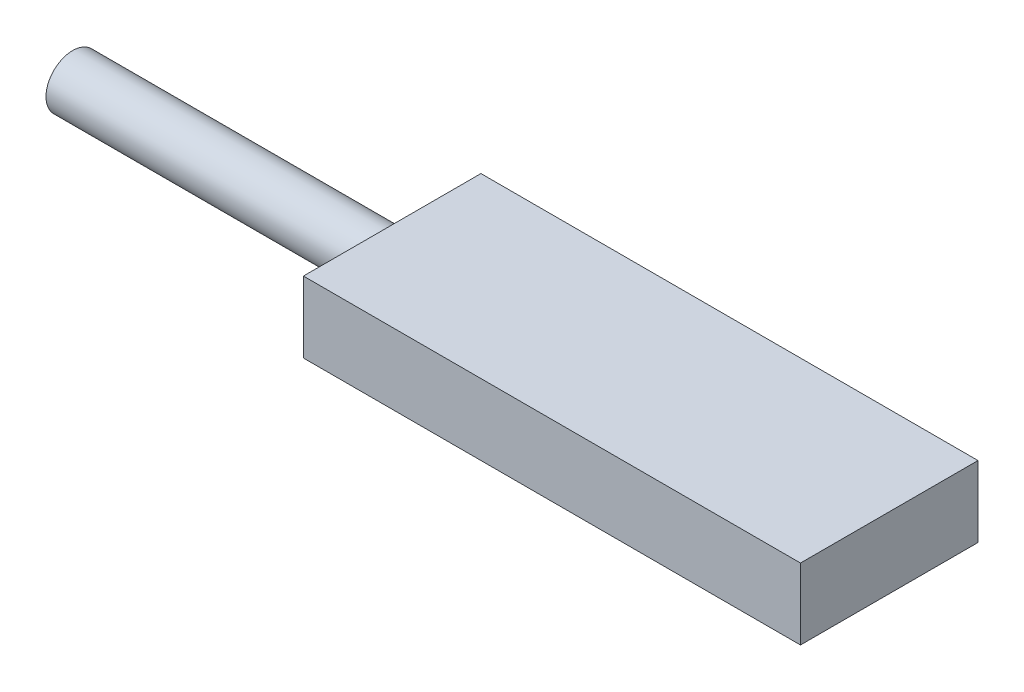
ISO-10303-21;
HEADER;
FILE_DESCRIPTION(('STEP AP214'),'2;1');
FILE_NAME('part.step','',(''),(''),'','','');
FILE_SCHEMA(('AUTOMOTIVE_DESIGN { 1 0 10303 214 1 1 1 1 }'));
ENDSEC;
DATA;
#1=APPLICATION_CONTEXT('core data for automotive mechanical design processes');
#2=APPLICATION_PROTOCOL_DEFINITION('international standard','automotive_design',2000,#1);
#3=PRODUCT_CONTEXT('',#1,'mechanical');
#4=PRODUCT('Part','Part','',(#3));
#5=PRODUCT_RELATED_PRODUCT_CATEGORY('part','',(#4));
#6=PRODUCT_DEFINITION_FORMATION('','',#4);
#7=PRODUCT_DEFINITION_CONTEXT('part definition',#1,'design');
#8=PRODUCT_DEFINITION('design','',#6,#7);
#9=PRODUCT_DEFINITION_SHAPE('','',#8);
#10=(LENGTH_UNIT() NAMED_UNIT(*) SI_UNIT(.MILLI.,.METRE.));
#11=(NAMED_UNIT(*) PLANE_ANGLE_UNIT() SI_UNIT($,.RADIAN.));
#12=(NAMED_UNIT(*) SI_UNIT($,.STERADIAN.) SOLID_ANGLE_UNIT());
#13=UNCERTAINTY_MEASURE_WITH_UNIT(LENGTH_MEASURE(1.E-05),#10,'distance_accuracy_value','');
#14=(GEOMETRIC_REPRESENTATION_CONTEXT(3) GLOBAL_UNCERTAINTY_ASSIGNED_CONTEXT((#13)) GLOBAL_UNIT_ASSIGNED_CONTEXT((#10,
#11,#12)) REPRESENTATION_CONTEXT('',''));
#15=CARTESIAN_POINT('',(0.,0.,0.));
#16=DIRECTION('',(0.,0.,1.));
#17=DIRECTION('',(1.,0.,0.));
#18=AXIS2_PLACEMENT_3D('',#15,#16,#17);
#19=CARTESIAN_POINT('',(44.45,12.7,15.875));
#20=DIRECTION('',(-1.,0.,0.));
#21=DIRECTION('',(0.,0.,1.));
#22=AXIS2_PLACEMENT_3D('',#19,#20,#21);
#23=PLANE('',#22);
#24=DIRECTION('',(0.,0.,-1.));
#25=VECTOR('',#24,1.);
#26=CARTESIAN_POINT('',(44.45,0.,15.875));
#27=LINE('',#26,#25);
#28=CARTESIAN_POINT('',(44.45,0.,15.875));
#29=VERTEX_POINT('',#28);
#30=CARTESIAN_POINT('',(44.45,0.,-15.875));
#31=VERTEX_POINT('',#30);
#32=EDGE_CURVE('E100',#29,#31,#27,.T.);
#33=ORIENTED_EDGE('',*,*,#32,.T.);
#34=DIRECTION('',(0.,-1.,0.));
#35=VECTOR('',#34,1.);
#36=CARTESIAN_POINT('',(44.45,12.7,-15.875));
#37=LINE('',#36,#35);
#38=CARTESIAN_POINT('',(44.45,12.7,-15.875));
#39=VERTEX_POINT('',#38);
#40=EDGE_CURVE('E37',#39,#31,#37,.T.);
#41=ORIENTED_EDGE('',*,*,#40,.F.);
#42=DIRECTION('',(0.,0.,-1.));
#43=VECTOR('',#42,1.);
#44=CARTESIAN_POINT('',(44.45,12.7,15.875));
#45=LINE('',#44,#43);
#46=CARTESIAN_POINT('',(44.45,12.7,15.875));
#47=VERTEX_POINT('',#46);
#48=EDGE_CURVE('E87',#47,#39,#45,.T.);
#49=ORIENTED_EDGE('',*,*,#48,.F.);
#50=DIRECTION('',(0.,-1.,0.));
#51=VECTOR('',#50,1.);
#52=CARTESIAN_POINT('',(44.45,12.7,15.875));
#53=LINE('',#52,#51);
#54=EDGE_CURVE('E96',#47,#29,#53,.T.);
#55=ORIENTED_EDGE('',*,*,#54,.T.);
#56=EDGE_LOOP('',(#33,#41,#49,#55));
#57=FACE_BOUND('',#56,.T.);
#58=ADVANCED_FACE('F34',(#57),#23,.F.);
#59=CARTESIAN_POINT('',(-44.45,12.7,-15.875));
#60=DIRECTION('',(0.,0.,1.));
#61=DIRECTION('',(1.,0.,0.));
#62=AXIS2_PLACEMENT_3D('',#59,#60,#61);
#63=PLANE('',#62);
#64=DIRECTION('',(-1.,0.,0.));
#65=VECTOR('',#64,1.);
#66=CARTESIAN_POINT('',(-44.45,0.,-15.875));
#67=LINE('',#66,#65);
#68=CARTESIAN_POINT('',(-44.45,0.,-15.875));
#69=VERTEX_POINT('',#68);
#70=EDGE_CURVE('E92',#31,#69,#67,.T.);
#71=ORIENTED_EDGE('',*,*,#70,.T.);
#72=DIRECTION('',(0.,-1.,0.));
#73=VECTOR('',#72,1.);
#74=CARTESIAN_POINT('',(-44.45,12.7,-15.875));
#75=LINE('',#74,#73);
#76=CARTESIAN_POINT('',(-44.45,12.7,-15.875));
#77=VERTEX_POINT('',#76);
#78=EDGE_CURVE('E90',#77,#69,#75,.T.);
#79=ORIENTED_EDGE('',*,*,#78,.F.);
#80=DIRECTION('',(-1.,0.,0.));
#81=VECTOR('',#80,1.);
#82=CARTESIAN_POINT('',(-44.45,12.7,-15.875));
#83=LINE('',#82,#81);
#84=EDGE_CURVE('E82',#39,#77,#83,.T.);
#85=ORIENTED_EDGE('',*,*,#84,.F.);
#86=ORIENTED_EDGE('',*,*,#40,.T.);
#87=EDGE_LOOP('',(#71,#79,#85,#86));
#88=FACE_BOUND('',#87,.T.);
#89=ADVANCED_FACE('F91',(#88),#63,.F.);
#90=CARTESIAN_POINT('',(-44.45,12.7,15.875));
#91=DIRECTION('',(1.,0.,0.));
#92=DIRECTION('',(0.,0.,-1.));
#93=AXIS2_PLACEMENT_3D('',#90,#91,#92);
#94=PLANE('',#93);
#95=CARTESIAN_POINT('',(-44.45,6.35,0.));
#96=DIRECTION('',(-1.,0.,0.));
#97=DIRECTION('',(0.,0.,1.));
#98=AXIS2_PLACEMENT_3D('',#95,#96,#97);
#99=CIRCLE('',#98,4.7625);
#100=CARTESIAN_POINT('',(-44.45,6.35,4.7625));
#101=VERTEX_POINT('',#100);
#102=EDGE_CURVE('E11',#101,#101,#99,.T.);
#103=ORIENTED_EDGE('',*,*,#102,.F.);
#104=EDGE_LOOP('',(#103));
#105=FACE_BOUND('',#104,.T.);
#106=DIRECTION('',(0.,0.,1.));
#107=VECTOR('',#106,1.);
#108=CARTESIAN_POINT('',(-44.45,0.,15.875));
#109=LINE('',#108,#107);
#110=CARTESIAN_POINT('',(-44.45,0.,15.875));
#111=VERTEX_POINT('',#110);
#112=EDGE_CURVE('E68',#69,#111,#109,.T.);
#113=ORIENTED_EDGE('',*,*,#112,.T.);
#114=DIRECTION('',(0.,-1.,0.));
#115=VECTOR('',#114,1.);
#116=CARTESIAN_POINT('',(-44.45,12.7,15.875));
#117=LINE('',#116,#115);
#118=CARTESIAN_POINT('',(-44.45,12.7,15.875));
#119=VERTEX_POINT('',#118);
#120=EDGE_CURVE('E93',#119,#111,#117,.T.);
#121=ORIENTED_EDGE('',*,*,#120,.F.);
#122=DIRECTION('',(0.,0.,1.));
#123=VECTOR('',#122,1.);
#124=CARTESIAN_POINT('',(-44.45,12.7,15.875));
#125=LINE('',#124,#123);
#126=EDGE_CURVE('E85',#77,#119,#125,.T.);
#127=ORIENTED_EDGE('',*,*,#126,.F.);
#128=ORIENTED_EDGE('',*,*,#78,.T.);
#129=EDGE_LOOP('',(#113,#121,#127,#128));
#130=FACE_BOUND('',#129,.T.);
#131=ADVANCED_FACE('F94',(#105,#130),#94,.F.);
#132=CARTESIAN_POINT('',(-44.45,12.7,15.875));
#133=DIRECTION('',(0.,0.,-1.));
#134=DIRECTION('',(-1.,0.,0.));
#135=AXIS2_PLACEMENT_3D('',#132,#133,#134);
#136=PLANE('',#135);
#137=DIRECTION('',(1.,0.,0.));
#138=VECTOR('',#137,1.);
#139=CARTESIAN_POINT('',(-44.45,0.,15.875));
#140=LINE('',#139,#138);
#141=EDGE_CURVE('E74',#111,#29,#140,.T.);
#142=ORIENTED_EDGE('',*,*,#141,.T.);
#143=ORIENTED_EDGE('',*,*,#54,.F.);
#144=DIRECTION('',(1.,0.,0.));
#145=VECTOR('',#144,1.);
#146=CARTESIAN_POINT('',(-44.45,12.7,15.875));
#147=LINE('',#146,#145);
#148=EDGE_CURVE('E51',#119,#47,#147,.T.);
#149=ORIENTED_EDGE('',*,*,#148,.F.);
#150=ORIENTED_EDGE('',*,*,#120,.T.);
#151=EDGE_LOOP('',(#142,#143,#149,#150));
#152=FACE_BOUND('',#151,.T.);
#153=ADVANCED_FACE('F108',(#152),#136,.F.);
#154=CARTESIAN_POINT('',(0.,12.7,0.));
#155=DIRECTION('',(0.,-1.,0.));
#156=DIRECTION('',(0.,0.,-1.));
#157=AXIS2_PLACEMENT_3D('',#154,#155,#156);
#158=PLANE('',#157);
#159=ORIENTED_EDGE('',*,*,#48,.T.);
#160=ORIENTED_EDGE('',*,*,#84,.T.);
#161=ORIENTED_EDGE('',*,*,#126,.T.);
#162=ORIENTED_EDGE('',*,*,#148,.T.);
#163=EDGE_LOOP('',(#159,#160,#161,#162));
#164=FACE_BOUND('',#163,.T.);
#165=ADVANCED_FACE('F83',(#164),#158,.F.);
#166=CARTESIAN_POINT('',(0.,0.,0.));
#167=DIRECTION('',(0.,-1.,0.));
#168=DIRECTION('',(0.,0.,-1.));
#169=AXIS2_PLACEMENT_3D('',#166,#167,#168);
#170=PLANE('',#169);
#171=ORIENTED_EDGE('',*,*,#32,.F.);
#172=ORIENTED_EDGE('',*,*,#141,.F.);
#173=ORIENTED_EDGE('',*,*,#112,.F.);
#174=ORIENTED_EDGE('',*,*,#70,.F.);
#175=EDGE_LOOP('',(#171,#172,#173,#174));
#176=FACE_BOUND('',#175,.T.);
#177=ADVANCED_FACE('F111',(#176),#170,.T.);
#178=CARTESIAN_POINT('',(-101.6,6.35,0.));
#179=DIRECTION('',(1.,0.,0.));
#180=DIRECTION('',(0.,0.,-1.));
#181=AXIS2_PLACEMENT_3D('',#178,#179,#180);
#182=CYLINDRICAL_SURFACE('',#181,4.7625);
#183=CARTESIAN_POINT('',(-101.6,6.35,0.));
#184=DIRECTION('',(-1.,0.,0.));
#185=DIRECTION('',(0.,0.,1.));
#186=AXIS2_PLACEMENT_3D('',#183,#184,#185);
#187=CIRCLE('',#186,4.7625);
#188=CARTESIAN_POINT('',(-101.6,6.35,4.7625));
#189=VERTEX_POINT('',#188);
#190=EDGE_CURVE('E103',#189,#189,#187,.T.);
#191=ORIENTED_EDGE('',*,*,#190,.F.);
#192=EDGE_LOOP('',(#191));
#193=FACE_BOUND('',#192,.T.);
#194=ORIENTED_EDGE('',*,*,#102,.T.);
#195=EDGE_LOOP('',(#194));
#196=FACE_BOUND('',#195,.T.);
#197=ADVANCED_FACE('F119',(#193,#196),#182,.T.);
#198=CARTESIAN_POINT('',(-101.6,6.35,0.));
#199=DIRECTION('',(-1.,0.,0.));
#200=DIRECTION('',(0.,0.,1.));
#201=AXIS2_PLACEMENT_3D('',#198,#199,#200);
#202=PLANE('',#201);
#203=ORIENTED_EDGE('',*,*,#190,.T.);
#204=EDGE_LOOP('',(#203));
#205=FACE_BOUND('',#204,.T.);
#206=ADVANCED_FACE('F117',(#205),#202,.T.);
#207=CLOSED_SHELL('',(#58,#89,#131,#153,#165,#177,#197,#206));
#208=MANIFOLD_SOLID_BREP('B2',#207);
#209=ADVANCED_BREP_SHAPE_REPRESENTATION('',(#18,#208),#14);
#210=SHAPE_DEFINITION_REPRESENTATION(#9,#209);
ENDSEC;
END-ISO-10303-21;
